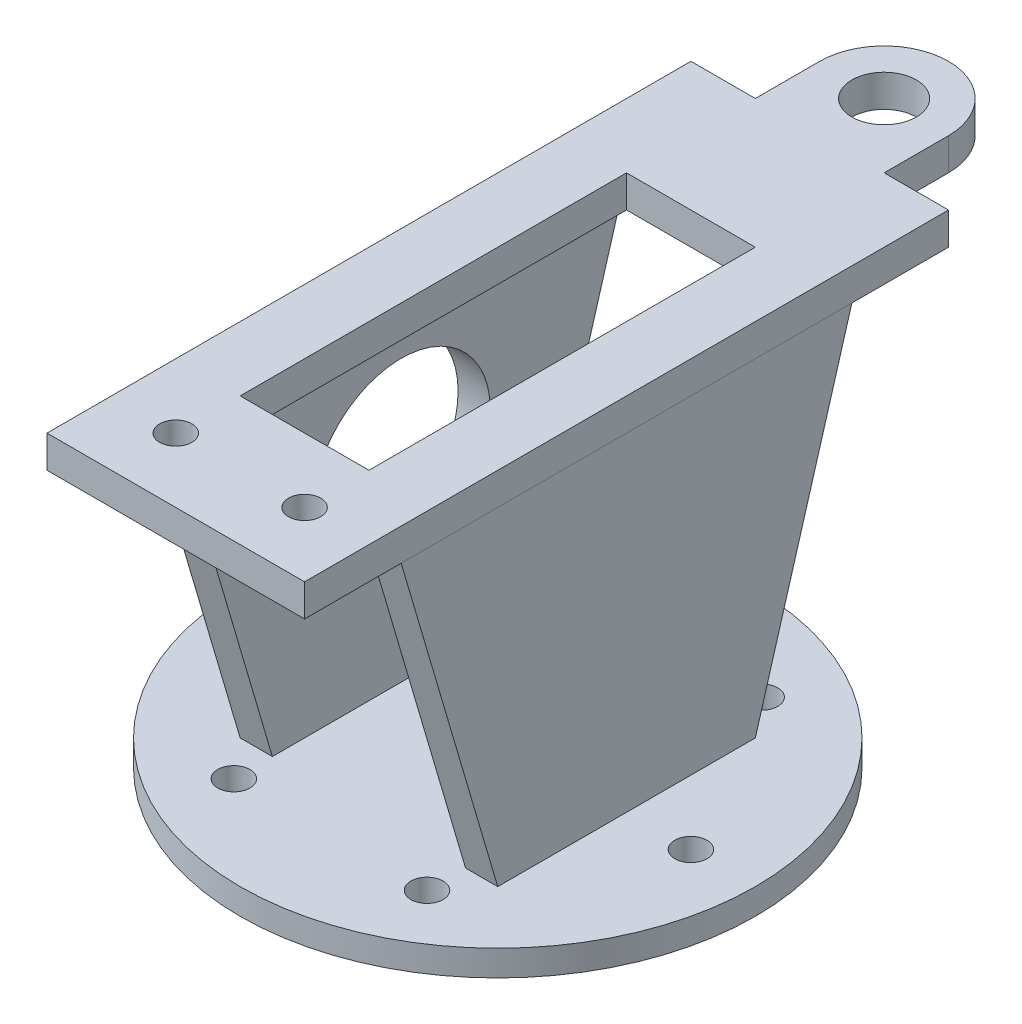
ISO-10303-21;
HEADER;
FILE_DESCRIPTION(('STEP AP214'),'2;1');
FILE_NAME('part.step','',(''),(''),'','','');
FILE_SCHEMA(('AUTOMOTIVE_DESIGN { 1 0 10303 214 1 1 1 1 }'));
ENDSEC;
DATA;
#1=APPLICATION_CONTEXT('core data for automotive mechanical design processes');
#2=APPLICATION_PROTOCOL_DEFINITION('international standard','automotive_design',2000,#1);
#3=PRODUCT_CONTEXT('',#1,'mechanical');
#4=PRODUCT('Part','Part','',(#3));
#5=PRODUCT_RELATED_PRODUCT_CATEGORY('part','',(#4));
#6=PRODUCT_DEFINITION_FORMATION('','',#4);
#7=PRODUCT_DEFINITION_CONTEXT('part definition',#1,'design');
#8=PRODUCT_DEFINITION('design','',#6,#7);
#9=PRODUCT_DEFINITION_SHAPE('','',#8);
#10=(LENGTH_UNIT() NAMED_UNIT(*) SI_UNIT(.MILLI.,.METRE.));
#11=(NAMED_UNIT(*) PLANE_ANGLE_UNIT() SI_UNIT($,.RADIAN.));
#12=(NAMED_UNIT(*) SI_UNIT($,.STERADIAN.) SOLID_ANGLE_UNIT());
#13=UNCERTAINTY_MEASURE_WITH_UNIT(LENGTH_MEASURE(1.E-05),#10,'distance_accuracy_value','');
#14=(GEOMETRIC_REPRESENTATION_CONTEXT(3) GLOBAL_UNCERTAINTY_ASSIGNED_CONTEXT((#13)) GLOBAL_UNIT_ASSIGNED_CONTEXT((#10,
#11,#12)) REPRESENTATION_CONTEXT('',''));
#15=CARTESIAN_POINT('',(0.,0.,0.));
#16=DIRECTION('',(0.,0.,1.));
#17=DIRECTION('',(1.,0.,0.));
#18=AXIS2_PLACEMENT_3D('',#15,#16,#17);
#19=CARTESIAN_POINT('',(19.05,69.85,-44.45));
#20=DIRECTION('',(0.,1.,0.));
#21=DIRECTION('',(0.,0.,1.));
#22=AXIS2_PLACEMENT_3D('',#19,#20,#21);
#23=PLANE('',#22);
#24=DIRECTION('',(0.,0.,1.));
#25=VECTOR('',#24,1.);
#26=CARTESIAN_POINT('',(25.4,69.85,-44.45));
#27=LINE('',#26,#25);
#28=CARTESIAN_POINT('',(25.4,69.85,-44.45));
#29=VERTEX_POINT('',#28);
#30=CARTESIAN_POINT('',(25.4,69.85,44.45));
#31=VERTEX_POINT('',#30);
#32=EDGE_CURVE('E114',#29,#31,#27,.T.);
#33=ORIENTED_EDGE('',*,*,#32,.F.);
#34=DIRECTION('',(1.,0.,0.));
#35=VECTOR('',#34,1.);
#36=CARTESIAN_POINT('',(19.05,69.85,-44.45));
#37=LINE('',#36,#35);
#38=CARTESIAN_POINT('',(19.05,69.85,-44.45));
#39=VERTEX_POINT('',#38);
#40=EDGE_CURVE('E12',#39,#29,#37,.T.);
#41=ORIENTED_EDGE('',*,*,#40,.F.);
#42=DIRECTION('',(0.,0.,1.));
#43=VECTOR('',#42,1.);
#44=CARTESIAN_POINT('',(19.05,69.85,-44.45));
#45=LINE('',#44,#43);
#46=CARTESIAN_POINT('',(19.05,69.85,44.45));
#47=VERTEX_POINT('',#46);
#48=EDGE_CURVE('E108',#39,#47,#45,.T.);
#49=ORIENTED_EDGE('',*,*,#48,.T.);
#50=DIRECTION('',(1.,0.,0.));
#51=VECTOR('',#50,1.);
#52=CARTESIAN_POINT('',(19.05,69.85,44.45));
#53=LINE('',#52,#51);
#54=EDGE_CURVE('E53',#47,#31,#53,.T.);
#55=ORIENTED_EDGE('',*,*,#54,.T.);
#56=EDGE_LOOP('',(#33,#41,#49,#55));
#57=FACE_BOUND('',#56,.T.);
#58=ADVANCED_FACE('F50',(#57),#23,.T.);
#59=CARTESIAN_POINT('',(19.05,5.08,-25.4));
#60=DIRECTION('',(0.,-0.28216632399155,-0.959365501571271));
#61=DIRECTION('',(0.,0.959365501571271,-0.28216632399155));
#62=AXIS2_PLACEMENT_3D('',#59,#60,#61);
#63=PLANE('',#62);
#64=DIRECTION('',(0.,0.959365501571271,-0.28216632399155));
#65=VECTOR('',#64,1.);
#66=CARTESIAN_POINT('',(25.4,5.08,-25.4));
#67=LINE('',#66,#65);
#68=CARTESIAN_POINT('',(25.4,5.08,-25.4));
#69=VERTEX_POINT('',#68);
#70=EDGE_CURVE('E110',#69,#29,#67,.T.);
#71=ORIENTED_EDGE('',*,*,#70,.F.);
#72=DIRECTION('',(1.,0.,0.));
#73=VECTOR('',#72,1.);
#74=CARTESIAN_POINT('',(19.05,5.08,-25.4));
#75=LINE('',#74,#73);
#76=CARTESIAN_POINT('',(19.05,5.08,-25.4));
#77=VERTEX_POINT('',#76);
#78=EDGE_CURVE('E59',#77,#69,#75,.T.);
#79=ORIENTED_EDGE('',*,*,#78,.F.);
#80=DIRECTION('',(0.,0.959365501571271,-0.28216632399155));
#81=VECTOR('',#80,1.);
#82=CARTESIAN_POINT('',(19.05,5.08,-25.4));
#83=LINE('',#82,#81);
#84=EDGE_CURVE('E105',#77,#39,#83,.T.);
#85=ORIENTED_EDGE('',*,*,#84,.T.);
#86=ORIENTED_EDGE('',*,*,#40,.T.);
#87=EDGE_LOOP('',(#71,#79,#85,#86));
#88=FACE_BOUND('',#87,.T.);
#89=ADVANCED_FACE('F124',(#88),#63,.T.);
#90=CARTESIAN_POINT('',(19.05,5.08,0.));
#91=DIRECTION('',(0.,-1.,0.));
#92=DIRECTION('',(0.,0.,-1.));
#93=AXIS2_PLACEMENT_3D('',#90,#91,#92);
#94=PLANE('',#93);
#95=DIRECTION('',(0.,0.,-1.));
#96=VECTOR('',#95,1.);
#97=CARTESIAN_POINT('',(25.4,5.08,0.));
#98=LINE('',#97,#96);
#99=CARTESIAN_POINT('',(25.4,5.08,25.4));
#100=VERTEX_POINT('',#99);
#101=EDGE_CURVE('E99',#100,#69,#98,.T.);
#102=ORIENTED_EDGE('',*,*,#101,.F.);
#103=DIRECTION('',(1.,0.,0.));
#104=VECTOR('',#103,1.);
#105=CARTESIAN_POINT('',(19.05,5.08,25.4));
#106=LINE('',#105,#104);
#107=CARTESIAN_POINT('',(19.05,5.08,25.4));
#108=VERTEX_POINT('',#107);
#109=EDGE_CURVE('E95',#108,#100,#106,.T.);
#110=ORIENTED_EDGE('',*,*,#109,.F.);
#111=DIRECTION('',(0.,0.,-1.));
#112=VECTOR('',#111,1.);
#113=CARTESIAN_POINT('',(19.05,5.08,25.4));
#114=LINE('',#113,#112);
#115=EDGE_CURVE('E98',#108,#77,#114,.T.);
#116=ORIENTED_EDGE('',*,*,#115,.T.);
#117=ORIENTED_EDGE('',*,*,#78,.T.);
#118=EDGE_LOOP('',(#102,#110,#116,#117));
#119=FACE_BOUND('',#118,.T.);
#120=ADVANCED_FACE('F97',(#119),#94,.T.);
#121=CARTESIAN_POINT('',(19.05,69.85,44.45));
#122=DIRECTION('',(0.,-0.28216632399155,0.959365501571271));
#123=DIRECTION('',(0.,-0.959365501571271,-0.28216632399155));
#124=AXIS2_PLACEMENT_3D('',#121,#122,#123);
#125=PLANE('',#124);
#126=DIRECTION('',(0.,-0.959365501571271,-0.28216632399155));
#127=VECTOR('',#126,1.);
#128=CARTESIAN_POINT('',(25.4,69.85,44.45));
#129=LINE('',#128,#127);
#130=EDGE_CURVE('E117',#31,#100,#129,.T.);
#131=ORIENTED_EDGE('',*,*,#130,.F.);
#132=ORIENTED_EDGE('',*,*,#54,.F.);
#133=DIRECTION('',(0.,-0.959365501571271,-0.28216632399155));
#134=VECTOR('',#133,1.);
#135=CARTESIAN_POINT('',(19.05,69.85,44.45));
#136=LINE('',#135,#134);
#137=EDGE_CURVE('E104',#47,#108,#136,.T.);
#138=ORIENTED_EDGE('',*,*,#137,.T.);
#139=ORIENTED_EDGE('',*,*,#109,.T.);
#140=EDGE_LOOP('',(#131,#132,#138,#139));
#141=FACE_BOUND('',#140,.T.);
#142=ADVANCED_FACE('F107',(#141),#125,.T.);
#143=CARTESIAN_POINT('',(19.05,0.,0.));
#144=DIRECTION('',(1.,0.,0.));
#145=DIRECTION('',(0.,0.,-1.));
#146=AXIS2_PLACEMENT_3D('',#143,#144,#145);
#147=PLANE('',#146);
#148=ORIENTED_EDGE('',*,*,#48,.F.);
#149=ORIENTED_EDGE('',*,*,#84,.F.);
#150=ORIENTED_EDGE('',*,*,#115,.F.);
#151=ORIENTED_EDGE('',*,*,#137,.F.);
#152=EDGE_LOOP('',(#148,#149,#150,#151));
#153=FACE_BOUND('',#152,.T.);
#154=ADVANCED_FACE('F103',(#153),#147,.F.);
#155=CARTESIAN_POINT('',(25.4,0.,0.));
#156=DIRECTION('',(1.,0.,0.));
#157=DIRECTION('',(0.,0.,-1.));
#158=AXIS2_PLACEMENT_3D('',#155,#156,#157);
#159=PLANE('',#158);
#160=ORIENTED_EDGE('',*,*,#32,.T.);
#161=ORIENTED_EDGE('',*,*,#130,.T.);
#162=ORIENTED_EDGE('',*,*,#101,.T.);
#163=ORIENTED_EDGE('',*,*,#70,.T.);
#164=EDGE_LOOP('',(#160,#161,#162,#163));
#165=FACE_BOUND('',#164,.T.);
#166=ADVANCED_FACE('F123',(#165),#159,.T.);
#167=CLOSED_SHELL('',(#58,#89,#120,#142,#154,#166));
#168=MANIFOLD_SOLID_BREP('B2',#167);
#169=CARTESIAN_POINT('',(-19.05,0.,0.));
#170=DIRECTION('',(1.,0.,0.));
#171=DIRECTION('',(0.,0.,-1.));
#172=AXIS2_PLACEMENT_3D('',#169,#170,#171);
#173=PLANE('',#172);
#174=DIRECTION('',(0.,0.,-1.));
#175=VECTOR('',#174,1.);
#176=CARTESIAN_POINT('',(-19.05,5.08,25.4));
#177=LINE('',#176,#175);
#178=CARTESIAN_POINT('',(-19.05,5.08,25.4));
#179=VERTEX_POINT('',#178);
#180=CARTESIAN_POINT('',(-19.05,5.08,-25.4));
#181=VERTEX_POINT('',#180);
#182=EDGE_CURVE('E233',#179,#181,#177,.T.);
#183=ORIENTED_EDGE('',*,*,#182,.T.);
#184=DIRECTION('',(0.,0.959365501571271,-0.28216632399155));
#185=VECTOR('',#184,1.);
#186=CARTESIAN_POINT('',(-19.05,5.08,-25.4));
#187=LINE('',#186,#185);
#188=CARTESIAN_POINT('',(-19.05,69.85,-44.45));
#189=VERTEX_POINT('',#188);
#190=EDGE_CURVE('E236',#181,#189,#187,.T.);
#191=ORIENTED_EDGE('',*,*,#190,.T.);
#192=DIRECTION('',(0.,0.,1.));
#193=VECTOR('',#192,1.);
#194=CARTESIAN_POINT('',(-19.05,69.85,-44.45));
#195=LINE('',#194,#193);
#196=CARTESIAN_POINT('',(-19.05,69.85,44.45));
#197=VERTEX_POINT('',#196);
#198=EDGE_CURVE('E240',#189,#197,#195,.T.);
#199=ORIENTED_EDGE('',*,*,#198,.T.);
#200=DIRECTION('',(0.,-0.959365501571271,-0.28216632399155));
#201=VECTOR('',#200,1.);
#202=CARTESIAN_POINT('',(-19.05,69.85,44.45));
#203=LINE('',#202,#201);
#204=EDGE_CURVE('E204',#197,#179,#203,.T.);
#205=ORIENTED_EDGE('',*,*,#204,.T.);
#206=EDGE_LOOP('',(#183,#191,#199,#205));
#207=FACE_BOUND('',#206,.T.);
#208=CARTESIAN_POINT('',(-19.05,42.8113563573053,0.));
#209=DIRECTION('',(1.,0.,0.));
#210=DIRECTION('',(0.,0.,-1.));
#211=AXIS2_PLACEMENT_3D('',#208,#209,#210);
#212=CIRCLE('',#211,17.5838015491556);
#213=CARTESIAN_POINT('',(-19.05,42.8113563573053,-17.5838015491556));
#214=VERTEX_POINT('',#213);
#215=EDGE_CURVE('E253',#214,#214,#212,.T.);
#216=ORIENTED_EDGE('',*,*,#215,.F.);
#217=EDGE_LOOP('',(#216));
#218=FACE_BOUND('',#217,.T.);
#219=ADVANCED_FACE('F187',(#207,#218),#173,.T.);
#220=CARTESIAN_POINT('',(-25.4,0.,0.));
#221=DIRECTION('',(1.,0.,0.));
#222=DIRECTION('',(0.,0.,-1.));
#223=AXIS2_PLACEMENT_3D('',#220,#221,#222);
#224=PLANE('',#223);
#225=DIRECTION('',(0.,0.,-1.));
#226=VECTOR('',#225,1.);
#227=CARTESIAN_POINT('',(-25.4,5.08,0.));
#228=LINE('',#227,#226);
#229=CARTESIAN_POINT('',(-25.4,5.08,25.4));
#230=VERTEX_POINT('',#229);
#231=CARTESIAN_POINT('',(-25.4,5.08,-25.4));
#232=VERTEX_POINT('',#231);
#233=EDGE_CURVE('E228',#230,#232,#228,.T.);
#234=ORIENTED_EDGE('',*,*,#233,.F.);
#235=DIRECTION('',(0.,-0.959365501571271,-0.28216632399155));
#236=VECTOR('',#235,1.);
#237=CARTESIAN_POINT('',(-25.4,69.85,44.45));
#238=LINE('',#237,#236);
#239=CARTESIAN_POINT('',(-25.4,69.85,44.45));
#240=VERTEX_POINT('',#239);
#241=EDGE_CURVE('E256',#240,#230,#238,.T.);
#242=ORIENTED_EDGE('',*,*,#241,.F.);
#243=DIRECTION('',(0.,0.,1.));
#244=VECTOR('',#243,1.);
#245=CARTESIAN_POINT('',(-25.4,69.85,-44.45));
#246=LINE('',#245,#244);
#247=CARTESIAN_POINT('',(-25.4,69.85,-44.45));
#248=VERTEX_POINT('',#247);
#249=EDGE_CURVE('E221',#248,#240,#246,.T.);
#250=ORIENTED_EDGE('',*,*,#249,.F.);
#251=DIRECTION('',(0.,0.959365501571271,-0.28216632399155));
#252=VECTOR('',#251,1.);
#253=CARTESIAN_POINT('',(-25.4,5.08,-25.4));
#254=LINE('',#253,#252);
#255=EDGE_CURVE('E244',#232,#248,#254,.T.);
#256=ORIENTED_EDGE('',*,*,#255,.F.);
#257=EDGE_LOOP('',(#234,#242,#250,#256));
#258=FACE_BOUND('',#257,.T.);
#259=CARTESIAN_POINT('',(-25.4,42.8113563573053,0.));
#260=DIRECTION('',(1.,0.,0.));
#261=DIRECTION('',(0.,0.,-1.));
#262=AXIS2_PLACEMENT_3D('',#259,#260,#261);
#263=CIRCLE('',#262,17.5838015491556);
#264=CARTESIAN_POINT('',(-25.4,42.8113563573053,-17.5838015491556));
#265=VERTEX_POINT('',#264);
#266=EDGE_CURVE('E268',#265,#265,#263,.T.);
#267=ORIENTED_EDGE('',*,*,#266,.T.);
#268=EDGE_LOOP('',(#267));
#269=FACE_BOUND('',#268,.T.);
#270=ADVANCED_FACE('F262',(#258,#269),#224,.F.);
#271=CARTESIAN_POINT('',(-19.05,5.08,0.));
#272=DIRECTION('',(0.,1.,0.));
#273=DIRECTION('',(0.,0.,1.));
#274=AXIS2_PLACEMENT_3D('',#271,#272,#273);
#275=PLANE('',#274);
#276=ORIENTED_EDGE('',*,*,#233,.T.);
#277=DIRECTION('',(-1.,0.,0.));
#278=VECTOR('',#277,1.);
#279=CARTESIAN_POINT('',(-19.05,5.08,-25.4));
#280=LINE('',#279,#278);
#281=EDGE_CURVE('E48',#181,#232,#280,.T.);
#282=ORIENTED_EDGE('',*,*,#281,.F.);
#283=ORIENTED_EDGE('',*,*,#182,.F.);
#284=DIRECTION('',(-1.,0.,0.));
#285=VECTOR('',#284,1.);
#286=CARTESIAN_POINT('',(-19.05,5.08,25.4));
#287=LINE('',#286,#285);
#288=EDGE_CURVE('E248',#179,#230,#287,.T.);
#289=ORIENTED_EDGE('',*,*,#288,.T.);
#290=EDGE_LOOP('',(#276,#282,#283,#289));
#291=FACE_BOUND('',#290,.T.);
#292=ADVANCED_FACE('F189',(#291),#275,.F.);
#293=CARTESIAN_POINT('',(-19.05,5.08,-25.4));
#294=DIRECTION('',(0.,0.28216632399155,0.959365501571271));
#295=DIRECTION('',(0.,-0.959365501571271,0.28216632399155));
#296=AXIS2_PLACEMENT_3D('',#293,#294,#295);
#297=PLANE('',#296);
#298=ORIENTED_EDGE('',*,*,#255,.T.);
#299=DIRECTION('',(-1.,0.,0.));
#300=VECTOR('',#299,1.);
#301=CARTESIAN_POINT('',(-19.05,69.85,-44.45));
#302=LINE('',#301,#300);
#303=EDGE_CURVE('E196',#189,#248,#302,.T.);
#304=ORIENTED_EDGE('',*,*,#303,.F.);
#305=ORIENTED_EDGE('',*,*,#190,.F.);
#306=ORIENTED_EDGE('',*,*,#281,.T.);
#307=EDGE_LOOP('',(#298,#304,#305,#306));
#308=FACE_BOUND('',#307,.T.);
#309=ADVANCED_FACE('F243',(#308),#297,.F.);
#310=CARTESIAN_POINT('',(-19.05,69.85,-44.45));
#311=DIRECTION('',(0.,-1.,0.));
#312=DIRECTION('',(0.,0.,-1.));
#313=AXIS2_PLACEMENT_3D('',#310,#311,#312);
#314=PLANE('',#313);
#315=ORIENTED_EDGE('',*,*,#249,.T.);
#316=DIRECTION('',(-1.,0.,0.));
#317=VECTOR('',#316,1.);
#318=CARTESIAN_POINT('',(-19.05,69.85,44.45));
#319=LINE('',#318,#317);
#320=EDGE_CURVE('E245',#197,#240,#319,.T.);
#321=ORIENTED_EDGE('',*,*,#320,.F.);
#322=ORIENTED_EDGE('',*,*,#198,.F.);
#323=ORIENTED_EDGE('',*,*,#303,.T.);
#324=EDGE_LOOP('',(#315,#321,#322,#323));
#325=FACE_BOUND('',#324,.T.);
#326=ADVANCED_FACE('F246',(#325),#314,.F.);
#327=CARTESIAN_POINT('',(-19.05,69.85,44.45));
#328=DIRECTION('',(0.,0.28216632399155,-0.959365501571271));
#329=DIRECTION('',(0.,0.959365501571271,0.28216632399155));
#330=AXIS2_PLACEMENT_3D('',#327,#328,#329);
#331=PLANE('',#330);
#332=ORIENTED_EDGE('',*,*,#241,.T.);
#333=ORIENTED_EDGE('',*,*,#288,.F.);
#334=ORIENTED_EDGE('',*,*,#204,.F.);
#335=ORIENTED_EDGE('',*,*,#320,.T.);
#336=EDGE_LOOP('',(#332,#333,#334,#335));
#337=FACE_BOUND('',#336,.T.);
#338=ADVANCED_FACE('F261',(#337),#331,.F.);
#339=CARTESIAN_POINT('',(-19.05,42.8113563573053,0.));
#340=DIRECTION('',(-1.,0.,0.));
#341=DIRECTION('',(0.,0.,1.));
#342=AXIS2_PLACEMENT_3D('',#339,#340,#341);
#343=CYLINDRICAL_SURFACE('',#342,17.5838015491556);
#344=ORIENTED_EDGE('',*,*,#215,.T.);
#345=EDGE_LOOP('',(#344));
#346=FACE_BOUND('',#345,.T.);
#347=ORIENTED_EDGE('',*,*,#266,.F.);
#348=EDGE_LOOP('',(#347));
#349=FACE_BOUND('',#348,.T.);
#350=ADVANCED_FACE('F275',(#346,#349),#343,.F.);
#351=CLOSED_SHELL('',(#219,#270,#292,#309,#326,#338,#350));
#352=MANIFOLD_SOLID_BREP('B6',#351);
#353=CARTESIAN_POINT('',(0.,76.2,-76.2));
#354=DIRECTION('',(0.,-1.,0.));
#355=DIRECTION('',(0.,0.,-1.));
#356=AXIS2_PLACEMENT_3D('',#353,#354,#355);
#357=PLANE('',#356);
#358=DIRECTION('',(0.,0.,1.));
#359=VECTOR('',#358,1.);
#360=CARTESIAN_POINT('',(-25.4,76.2,63.5));
#361=LINE('',#360,#359);
#362=CARTESIAN_POINT('',(-25.4,76.2,-63.5));
#363=VERTEX_POINT('',#362);
#364=CARTESIAN_POINT('',(-25.4,76.2,63.5));
#365=VERTEX_POINT('',#364);
#366=EDGE_CURVE('E469',#363,#365,#361,.T.);
#367=ORIENTED_EDGE('',*,*,#366,.T.);
#368=DIRECTION('',(1.,0.,0.));
#369=VECTOR('',#368,1.);
#370=CARTESIAN_POINT('',(25.4,76.2,63.5));
#371=LINE('',#370,#369);
#372=CARTESIAN_POINT('',(25.4,76.2,63.5));
#373=VERTEX_POINT('',#372);
#374=EDGE_CURVE('E472',#365,#373,#371,.T.);
#375=ORIENTED_EDGE('',*,*,#374,.T.);
#376=DIRECTION('',(0.,0.,-1.));
#377=VECTOR('',#376,1.);
#378=CARTESIAN_POINT('',(25.4,76.2,63.5));
#379=LINE('',#378,#377);
#380=CARTESIAN_POINT('',(25.4,76.2,-63.5));
#381=VERTEX_POINT('',#380);
#382=EDGE_CURVE('E475',#373,#381,#379,.T.);
#383=ORIENTED_EDGE('',*,*,#382,.T.);
#384=DIRECTION('',(-1.,0.,0.));
#385=VECTOR('',#384,1.);
#386=CARTESIAN_POINT('',(25.4,76.2,-63.5));
#387=LINE('',#386,#385);
#388=CARTESIAN_POINT('',(12.7,76.2,-63.5));
#389=VERTEX_POINT('',#388);
#390=EDGE_CURVE('E477',#381,#389,#387,.T.);
#391=ORIENTED_EDGE('',*,*,#390,.T.);
#392=DIRECTION('',(0.,0.,-1.));
#393=VECTOR('',#392,1.);
#394=CARTESIAN_POINT('',(12.7,76.2,-63.5));
#395=LINE('',#394,#393);
#396=CARTESIAN_POINT('',(12.7,76.2,-76.2));
#397=VERTEX_POINT('',#396);
#398=EDGE_CURVE('E479',#389,#397,#395,.T.);
#399=ORIENTED_EDGE('',*,*,#398,.T.);
#400=CARTESIAN_POINT('',(0.,76.2,-76.2));
#401=DIRECTION('',(0.,1.,0.));
#402=DIRECTION('',(0.,0.,-1.));
#403=AXIS2_PLACEMENT_3D('',#400,#401,#402);
#404=CIRCLE('',#403,12.7);
#405=CARTESIAN_POINT('',(-12.7,76.2,-76.2));
#406=VERTEX_POINT('',#405);
#407=EDGE_CURVE('E481',#397,#406,#404,.T.);
#408=ORIENTED_EDGE('',*,*,#407,.T.);
#409=DIRECTION('',(0.,0.,1.));
#410=VECTOR('',#409,1.);
#411=CARTESIAN_POINT('',(-12.7,76.2,-63.5));
#412=LINE('',#411,#410);
#413=CARTESIAN_POINT('',(-12.7,76.2,-63.5));
#414=VERTEX_POINT('',#413);
#415=EDGE_CURVE('E483',#406,#414,#412,.T.);
#416=ORIENTED_EDGE('',*,*,#415,.T.);
#417=DIRECTION('',(-1.,0.,0.));
#418=VECTOR('',#417,1.);
#419=CARTESIAN_POINT('',(-12.7,76.2,-63.5));
#420=LINE('',#419,#418);
#421=EDGE_CURVE('E485',#414,#363,#420,.T.);
#422=ORIENTED_EDGE('',*,*,#421,.T.);
#423=EDGE_LOOP('',(#367,#375,#383,#391,#399,#408,#416,#422));
#424=FACE_BOUND('',#423,.T.);
#425=DIRECTION('',(0.,0.,1.));
#426=VECTOR('',#425,1.);
#427=CARTESIAN_POINT('',(-12.7,76.2,38.1));
#428=LINE('',#427,#426);
#429=CARTESIAN_POINT('',(-12.7,76.2,-38.1));
#430=VERTEX_POINT('',#429);
#431=CARTESIAN_POINT('',(-12.7,76.2,38.1));
#432=VERTEX_POINT('',#431);
#433=EDGE_CURVE('E430',#430,#432,#428,.T.);
#434=ORIENTED_EDGE('',*,*,#433,.F.);
#435=DIRECTION('',(-1.,0.,0.));
#436=VECTOR('',#435,1.);
#437=CARTESIAN_POINT('',(12.7,76.2,-38.1));
#438=LINE('',#437,#436);
#439=CARTESIAN_POINT('',(12.7,76.2,-38.1));
#440=VERTEX_POINT('',#439);
#441=EDGE_CURVE('E453',#440,#430,#438,.T.);
#442=ORIENTED_EDGE('',*,*,#441,.F.);
#443=DIRECTION('',(0.,0.,-1.));
#444=VECTOR('',#443,1.);
#445=CARTESIAN_POINT('',(12.7,76.2,38.1));
#446=LINE('',#445,#444);
#447=CARTESIAN_POINT('',(12.7,76.2,38.1));
#448=VERTEX_POINT('',#447);
#449=EDGE_CURVE('E451',#448,#440,#446,.T.);
#450=ORIENTED_EDGE('',*,*,#449,.F.);
#451=DIRECTION('',(1.,0.,0.));
#452=VECTOR('',#451,1.);
#453=CARTESIAN_POINT('',(12.7,76.2,38.1));
#454=LINE('',#453,#452);
#455=EDGE_CURVE('E438',#432,#448,#454,.T.);
#456=ORIENTED_EDGE('',*,*,#455,.F.);
#457=EDGE_LOOP('',(#434,#442,#450,#456));
#458=FACE_BOUND('',#457,.T.);
#459=CARTESIAN_POINT('',(0.,76.2,-76.2));
#460=DIRECTION('',(0.,1.,0.));
#461=DIRECTION('',(0.,0.,1.));
#462=AXIS2_PLACEMENT_3D('',#459,#460,#461);
#463=CIRCLE('',#462,6.35);
#464=CARTESIAN_POINT('',(0.,76.2,-69.85));
#465=VERTEX_POINT('',#464);
#466=EDGE_CURVE('E459',#465,#465,#463,.T.);
#467=ORIENTED_EDGE('',*,*,#466,.F.);
#468=EDGE_LOOP('',(#467));
#469=FACE_BOUND('',#468,.T.);
#470=CARTESIAN_POINT('',(12.7,76.2,50.8));
#471=DIRECTION('',(0.,1.,0.));
#472=DIRECTION('',(0.,0.,1.));
#473=AXIS2_PLACEMENT_3D('',#470,#471,#472);
#474=CIRCLE('',#473,3.175);
#475=CARTESIAN_POINT('',(12.7,76.2,53.975));
#476=VERTEX_POINT('',#475);
#477=EDGE_CURVE('E621',#476,#476,#474,.T.);
#478=ORIENTED_EDGE('',*,*,#477,.F.);
#479=EDGE_LOOP('',(#478));
#480=FACE_BOUND('',#479,.T.);
#481=CARTESIAN_POINT('',(-12.7,76.2,50.8));
#482=DIRECTION('',(0.,1.,0.));
#483=DIRECTION('',(0.,0.,1.));
#484=AXIS2_PLACEMENT_3D('',#481,#482,#483);
#485=CIRCLE('',#484,3.175);
#486=CARTESIAN_POINT('',(-12.7,76.2,53.975));
#487=VERTEX_POINT('',#486);
#488=EDGE_CURVE('E612',#487,#487,#485,.T.);
#489=ORIENTED_EDGE('',*,*,#488,.F.);
#490=EDGE_LOOP('',(#489));
#491=FACE_BOUND('',#490,.T.);
#492=ADVANCED_FACE('F341',(#424,#458,#469,#480,#491),#357,.F.);
#493=CARTESIAN_POINT('',(0.,69.85,-76.2));
#494=DIRECTION('',(0.,-1.,0.));
#495=DIRECTION('',(0.,0.,-1.));
#496=AXIS2_PLACEMENT_3D('',#493,#494,#495);
#497=PLANE('',#496);
#498=CARTESIAN_POINT('',(12.7,69.85,50.8));
#499=DIRECTION('',(0.,1.,0.));
#500=DIRECTION('',(0.,0.,1.));
#501=AXIS2_PLACEMENT_3D('',#498,#499,#500);
#502=CIRCLE('',#501,3.175);
#503=CARTESIAN_POINT('',(12.7,69.85,53.975));
#504=VERTEX_POINT('',#503);
#505=EDGE_CURVE('E618',#504,#504,#502,.T.);
#506=ORIENTED_EDGE('',*,*,#505,.T.);
#507=EDGE_LOOP('',(#506));
#508=FACE_BOUND('',#507,.T.);
#509=DIRECTION('',(-1.,0.,0.));
#510=VECTOR('',#509,1.);
#511=CARTESIAN_POINT('',(12.7,69.85,-38.1));
#512=LINE('',#511,#510);
#513=CARTESIAN_POINT('',(12.7,69.85,-38.1));
#514=VERTEX_POINT('',#513);
#515=CARTESIAN_POINT('',(-12.7,69.85,-38.1));
#516=VERTEX_POINT('',#515);
#517=EDGE_CURVE('E439',#514,#516,#512,.T.);
#518=ORIENTED_EDGE('',*,*,#517,.T.);
#519=DIRECTION('',(0.,0.,1.));
#520=VECTOR('',#519,1.);
#521=CARTESIAN_POINT('',(-12.7,69.85,38.1));
#522=LINE('',#521,#520);
#523=CARTESIAN_POINT('',(-12.7,69.85,38.1));
#524=VERTEX_POINT('',#523);
#525=EDGE_CURVE('E364',#516,#524,#522,.T.);
#526=ORIENTED_EDGE('',*,*,#525,.T.);
#527=DIRECTION('',(1.,0.,0.));
#528=VECTOR('',#527,1.);
#529=CARTESIAN_POINT('',(12.7,69.85,38.1));
#530=LINE('',#529,#528);
#531=CARTESIAN_POINT('',(12.7,69.85,38.1));
#532=VERTEX_POINT('',#531);
#533=EDGE_CURVE('E445',#524,#532,#530,.T.);
#534=ORIENTED_EDGE('',*,*,#533,.T.);
#535=DIRECTION('',(0.,0.,-1.));
#536=VECTOR('',#535,1.);
#537=CARTESIAN_POINT('',(12.7,69.85,38.1));
#538=LINE('',#537,#536);
#539=EDGE_CURVE('E461',#532,#514,#538,.T.);
#540=ORIENTED_EDGE('',*,*,#539,.T.);
#541=EDGE_LOOP('',(#518,#526,#534,#540));
#542=FACE_BOUND('',#541,.T.);
#543=DIRECTION('',(0.,0.,1.));
#544=VECTOR('',#543,1.);
#545=CARTESIAN_POINT('',(-25.4,69.85,63.5));
#546=LINE('',#545,#544);
#547=CARTESIAN_POINT('',(-25.4,69.85,-63.5));
#548=VERTEX_POINT('',#547);
#549=CARTESIAN_POINT('',(-25.4,69.85,63.5));
#550=VERTEX_POINT('',#549);
#551=EDGE_CURVE('E446',#548,#550,#546,.T.);
#552=ORIENTED_EDGE('',*,*,#551,.F.);
#553=DIRECTION('',(-1.,0.,0.));
#554=VECTOR('',#553,1.);
#555=CARTESIAN_POINT('',(-12.7,69.85,-63.5));
#556=LINE('',#555,#554);
#557=CARTESIAN_POINT('',(-12.7,69.85,-63.5));
#558=VERTEX_POINT('',#557);
#559=EDGE_CURVE('E473',#558,#548,#556,.T.);
#560=ORIENTED_EDGE('',*,*,#559,.F.);
#561=DIRECTION('',(0.,0.,1.));
#562=VECTOR('',#561,1.);
#563=CARTESIAN_POINT('',(-12.7,69.85,-63.5));
#564=LINE('',#563,#562);
#565=CARTESIAN_POINT('',(-12.7,69.85,-76.2));
#566=VERTEX_POINT('',#565);
#567=EDGE_CURVE('E500',#566,#558,#564,.T.);
#568=ORIENTED_EDGE('',*,*,#567,.F.);
#569=CARTESIAN_POINT('',(0.,69.85,-76.2));
#570=DIRECTION('',(0.,1.,0.));
#571=DIRECTION('',(0.,0.,-1.));
#572=AXIS2_PLACEMENT_3D('',#569,#570,#571);
#573=CIRCLE('',#572,12.7);
#574=CARTESIAN_POINT('',(12.7,69.85,-76.2));
#575=VERTEX_POINT('',#574);
#576=EDGE_CURVE('E498',#575,#566,#573,.T.);
#577=ORIENTED_EDGE('',*,*,#576,.F.);
#578=DIRECTION('',(0.,0.,-1.));
#579=VECTOR('',#578,1.);
#580=CARTESIAN_POINT('',(12.7,69.85,-63.5));
#581=LINE('',#580,#579);
#582=CARTESIAN_POINT('',(12.7,69.85,-63.5));
#583=VERTEX_POINT('',#582);
#584=EDGE_CURVE('E496',#583,#575,#581,.T.);
#585=ORIENTED_EDGE('',*,*,#584,.F.);
#586=DIRECTION('',(-1.,0.,0.));
#587=VECTOR('',#586,1.);
#588=CARTESIAN_POINT('',(25.4,69.85,-63.5));
#589=LINE('',#588,#587);
#590=CARTESIAN_POINT('',(25.4,69.85,-63.5));
#591=VERTEX_POINT('',#590);
#592=EDGE_CURVE('E494',#591,#583,#589,.T.);
#593=ORIENTED_EDGE('',*,*,#592,.F.);
#594=DIRECTION('',(0.,0.,-1.));
#595=VECTOR('',#594,1.);
#596=CARTESIAN_POINT('',(25.4,69.85,63.5));
#597=LINE('',#596,#595);
#598=CARTESIAN_POINT('',(25.4,69.85,63.5));
#599=VERTEX_POINT('',#598);
#600=EDGE_CURVE('E492',#599,#591,#597,.T.);
#601=ORIENTED_EDGE('',*,*,#600,.F.);
#602=DIRECTION('',(1.,0.,0.));
#603=VECTOR('',#602,1.);
#604=CARTESIAN_POINT('',(25.4,69.85,63.5));
#605=LINE('',#604,#603);
#606=EDGE_CURVE('E490',#550,#599,#605,.T.);
#607=ORIENTED_EDGE('',*,*,#606,.F.);
#608=EDGE_LOOP('',(#552,#560,#568,#577,#585,#593,#601,#607));
#609=FACE_BOUND('',#608,.T.);
#610=CARTESIAN_POINT('',(0.,69.85,-76.2));
#611=DIRECTION('',(0.,1.,0.));
#612=DIRECTION('',(0.,0.,1.));
#613=AXIS2_PLACEMENT_3D('',#610,#611,#612);
#614=CIRCLE('',#613,6.35);
#615=CARTESIAN_POINT('',(0.,69.85,-69.85));
#616=VERTEX_POINT('',#615);
#617=EDGE_CURVE('E624',#616,#616,#614,.T.);
#618=ORIENTED_EDGE('',*,*,#617,.T.);
#619=EDGE_LOOP('',(#618));
#620=FACE_BOUND('',#619,.T.);
#621=CARTESIAN_POINT('',(-12.7,69.85,50.8));
#622=DIRECTION('',(0.,1.,0.));
#623=DIRECTION('',(0.,0.,1.));
#624=AXIS2_PLACEMENT_3D('',#621,#622,#623);
#625=CIRCLE('',#624,3.175);
#626=CARTESIAN_POINT('',(-12.7,69.85,53.975));
#627=VERTEX_POINT('',#626);
#628=EDGE_CURVE('E615',#627,#627,#625,.T.);
#629=ORIENTED_EDGE('',*,*,#628,.T.);
#630=EDGE_LOOP('',(#629));
#631=FACE_BOUND('',#630,.T.);
#632=ADVANCED_FACE('F530',(#508,#542,#609,#620,#631),#497,.T.);
#633=CARTESIAN_POINT('',(-25.4,76.2,63.5));
#634=DIRECTION('',(1.,0.,0.));
#635=DIRECTION('',(0.,0.,-1.));
#636=AXIS2_PLACEMENT_3D('',#633,#634,#635);
#637=PLANE('',#636);
#638=ORIENTED_EDGE('',*,*,#551,.T.);
#639=DIRECTION('',(0.,-1.,0.));
#640=VECTOR('',#639,1.);
#641=CARTESIAN_POINT('',(-25.4,76.2,63.5));
#642=LINE('',#641,#640);
#643=EDGE_CURVE('E185',#365,#550,#642,.T.);
#644=ORIENTED_EDGE('',*,*,#643,.F.);
#645=ORIENTED_EDGE('',*,*,#366,.F.);
#646=DIRECTION('',(0.,-1.,0.));
#647=VECTOR('',#646,1.);
#648=CARTESIAN_POINT('',(-25.4,76.2,-63.5));
#649=LINE('',#648,#647);
#650=EDGE_CURVE('E487',#363,#548,#649,.T.);
#651=ORIENTED_EDGE('',*,*,#650,.T.);
#652=EDGE_LOOP('',(#638,#644,#645,#651));
#653=FACE_BOUND('',#652,.T.);
#654=ADVANCED_FACE('F343',(#653),#637,.F.);
#655=CARTESIAN_POINT('',(25.4,76.2,63.5));
#656=DIRECTION('',(0.,0.,-1.));
#657=DIRECTION('',(-1.,0.,0.));
#658=AXIS2_PLACEMENT_3D('',#655,#656,#657);
#659=PLANE('',#658);
#660=ORIENTED_EDGE('',*,*,#606,.T.);
#661=DIRECTION('',(0.,-1.,0.));
#662=VECTOR('',#661,1.);
#663=CARTESIAN_POINT('',(25.4,76.2,63.5));
#664=LINE('',#663,#662);
#665=EDGE_CURVE('E349',#373,#599,#664,.T.);
#666=ORIENTED_EDGE('',*,*,#665,.F.);
#667=ORIENTED_EDGE('',*,*,#374,.F.);
#668=ORIENTED_EDGE('',*,*,#643,.T.);
#669=EDGE_LOOP('',(#660,#666,#667,#668));
#670=FACE_BOUND('',#669,.T.);
#671=ADVANCED_FACE('F547',(#670),#659,.F.);
#672=CARTESIAN_POINT('',(25.4,76.2,63.5));
#673=DIRECTION('',(-1.,0.,0.));
#674=DIRECTION('',(0.,0.,1.));
#675=AXIS2_PLACEMENT_3D('',#672,#673,#674);
#676=PLANE('',#675);
#677=ORIENTED_EDGE('',*,*,#600,.T.);
#678=DIRECTION('',(0.,-1.,0.));
#679=VECTOR('',#678,1.);
#680=CARTESIAN_POINT('',(25.4,76.2,-63.5));
#681=LINE('',#680,#679);
#682=EDGE_CURVE('E517',#381,#591,#681,.T.);
#683=ORIENTED_EDGE('',*,*,#682,.F.);
#684=ORIENTED_EDGE('',*,*,#382,.F.);
#685=ORIENTED_EDGE('',*,*,#665,.T.);
#686=EDGE_LOOP('',(#677,#683,#684,#685));
#687=FACE_BOUND('',#686,.T.);
#688=ADVANCED_FACE('F524',(#687),#676,.F.);
#689=CARTESIAN_POINT('',(25.4,76.2,-63.5));
#690=DIRECTION('',(0.,0.,1.));
#691=DIRECTION('',(1.,0.,0.));
#692=AXIS2_PLACEMENT_3D('',#689,#690,#691);
#693=PLANE('',#692);
#694=ORIENTED_EDGE('',*,*,#592,.T.);
#695=DIRECTION('',(0.,-1.,0.));
#696=VECTOR('',#695,1.);
#697=CARTESIAN_POINT('',(12.7,76.2,-63.5));
#698=LINE('',#697,#696);
#699=EDGE_CURVE('E514',#389,#583,#698,.T.);
#700=ORIENTED_EDGE('',*,*,#699,.F.);
#701=ORIENTED_EDGE('',*,*,#390,.F.);
#702=ORIENTED_EDGE('',*,*,#682,.T.);
#703=EDGE_LOOP('',(#694,#700,#701,#702));
#704=FACE_BOUND('',#703,.T.);
#705=ADVANCED_FACE('F536',(#704),#693,.F.);
#706=CARTESIAN_POINT('',(12.7,76.2,-63.5));
#707=DIRECTION('',(-1.,0.,0.));
#708=DIRECTION('',(0.,0.,1.));
#709=AXIS2_PLACEMENT_3D('',#706,#707,#708);
#710=PLANE('',#709);
#711=ORIENTED_EDGE('',*,*,#584,.T.);
#712=DIRECTION('',(0.,-1.,0.));
#713=VECTOR('',#712,1.);
#714=CARTESIAN_POINT('',(12.7,76.2,-76.2));
#715=LINE('',#714,#713);
#716=EDGE_CURVE('E511',#397,#575,#715,.T.);
#717=ORIENTED_EDGE('',*,*,#716,.F.);
#718=ORIENTED_EDGE('',*,*,#398,.F.);
#719=ORIENTED_EDGE('',*,*,#699,.T.);
#720=EDGE_LOOP('',(#711,#717,#718,#719));
#721=FACE_BOUND('',#720,.T.);
#722=ADVANCED_FACE('F540',(#721),#710,.F.);
#723=CARTESIAN_POINT('',(0.,76.2,-76.2));
#724=DIRECTION('',(0.,-1.,0.));
#725=DIRECTION('',(0.,0.,-1.));
#726=AXIS2_PLACEMENT_3D('',#723,#724,#725);
#727=CYLINDRICAL_SURFACE('',#726,12.7);
#728=ORIENTED_EDGE('',*,*,#576,.T.);
#729=DIRECTION('',(0.,-1.,0.));
#730=VECTOR('',#729,1.);
#731=CARTESIAN_POINT('',(-12.7,76.2,-76.2));
#732=LINE('',#731,#730);
#733=EDGE_CURVE('E508',#406,#566,#732,.T.);
#734=ORIENTED_EDGE('',*,*,#733,.F.);
#735=ORIENTED_EDGE('',*,*,#407,.F.);
#736=ORIENTED_EDGE('',*,*,#716,.T.);
#737=EDGE_LOOP('',(#728,#734,#735,#736));
#738=FACE_BOUND('',#737,.T.);
#739=ADVANCED_FACE('F560',(#738),#727,.T.);
#740=CARTESIAN_POINT('',(-12.7,76.2,-63.5));
#741=DIRECTION('',(1.,0.,0.));
#742=DIRECTION('',(0.,0.,-1.));
#743=AXIS2_PLACEMENT_3D('',#740,#741,#742);
#744=PLANE('',#743);
#745=ORIENTED_EDGE('',*,*,#567,.T.);
#746=DIRECTION('',(0.,-1.,0.));
#747=VECTOR('',#746,1.);
#748=CARTESIAN_POINT('',(-12.7,76.2,-63.5));
#749=LINE('',#748,#747);
#750=EDGE_CURVE('E505',#414,#558,#749,.T.);
#751=ORIENTED_EDGE('',*,*,#750,.F.);
#752=ORIENTED_EDGE('',*,*,#415,.F.);
#753=ORIENTED_EDGE('',*,*,#733,.T.);
#754=EDGE_LOOP('',(#745,#751,#752,#753));
#755=FACE_BOUND('',#754,.T.);
#756=ADVANCED_FACE('F558',(#755),#744,.F.);
#757=CARTESIAN_POINT('',(-12.7,76.2,-63.5));
#758=DIRECTION('',(0.,0.,1.));
#759=DIRECTION('',(1.,0.,0.));
#760=AXIS2_PLACEMENT_3D('',#757,#758,#759);
#761=PLANE('',#760);
#762=ORIENTED_EDGE('',*,*,#559,.T.);
#763=ORIENTED_EDGE('',*,*,#650,.F.);
#764=ORIENTED_EDGE('',*,*,#421,.F.);
#765=ORIENTED_EDGE('',*,*,#750,.T.);
#766=EDGE_LOOP('',(#762,#763,#764,#765));
#767=FACE_BOUND('',#766,.T.);
#768=ADVANCED_FACE('F553',(#767),#761,.F.);
#769=CARTESIAN_POINT('',(-12.7,76.2,38.1));
#770=DIRECTION('',(1.,0.,0.));
#771=DIRECTION('',(0.,0.,-1.));
#772=AXIS2_PLACEMENT_3D('',#769,#770,#771);
#773=PLANE('',#772);
#774=ORIENTED_EDGE('',*,*,#525,.F.);
#775=DIRECTION('',(0.,-1.,0.));
#776=VECTOR('',#775,1.);
#777=CARTESIAN_POINT('',(-12.7,76.2,-38.1));
#778=LINE('',#777,#776);
#779=EDGE_CURVE('E434',#430,#516,#778,.T.);
#780=ORIENTED_EDGE('',*,*,#779,.F.);
#781=ORIENTED_EDGE('',*,*,#433,.T.);
#782=DIRECTION('',(0.,-1.,0.));
#783=VECTOR('',#782,1.);
#784=CARTESIAN_POINT('',(-12.7,76.2,38.1));
#785=LINE('',#784,#783);
#786=EDGE_CURVE('E433',#432,#524,#785,.T.);
#787=ORIENTED_EDGE('',*,*,#786,.T.);
#788=EDGE_LOOP('',(#774,#780,#781,#787));
#789=FACE_BOUND('',#788,.T.);
#790=ADVANCED_FACE('F432',(#789),#773,.T.);
#791=CARTESIAN_POINT('',(12.7,76.2,38.1));
#792=DIRECTION('',(0.,0.,-1.));
#793=DIRECTION('',(-1.,0.,0.));
#794=AXIS2_PLACEMENT_3D('',#791,#792,#793);
#795=PLANE('',#794);
#796=ORIENTED_EDGE('',*,*,#533,.F.);
#797=ORIENTED_EDGE('',*,*,#786,.F.);
#798=ORIENTED_EDGE('',*,*,#455,.T.);
#799=DIRECTION('',(0.,-1.,0.));
#800=VECTOR('',#799,1.);
#801=CARTESIAN_POINT('',(12.7,76.2,38.1));
#802=LINE('',#801,#800);
#803=EDGE_CURVE('E447',#448,#532,#802,.T.);
#804=ORIENTED_EDGE('',*,*,#803,.T.);
#805=EDGE_LOOP('',(#796,#797,#798,#804));
#806=FACE_BOUND('',#805,.T.);
#807=ADVANCED_FACE('F442',(#806),#795,.T.);
#808=CARTESIAN_POINT('',(12.7,76.2,38.1));
#809=DIRECTION('',(-1.,0.,0.));
#810=DIRECTION('',(0.,0.,1.));
#811=AXIS2_PLACEMENT_3D('',#808,#809,#810);
#812=PLANE('',#811);
#813=ORIENTED_EDGE('',*,*,#539,.F.);
#814=ORIENTED_EDGE('',*,*,#803,.F.);
#815=ORIENTED_EDGE('',*,*,#449,.T.);
#816=DIRECTION('',(0.,-1.,0.));
#817=VECTOR('',#816,1.);
#818=CARTESIAN_POINT('',(12.7,76.2,-38.1));
#819=LINE('',#818,#817);
#820=EDGE_CURVE('E356',#440,#514,#819,.T.);
#821=ORIENTED_EDGE('',*,*,#820,.T.);
#822=EDGE_LOOP('',(#813,#814,#815,#821));
#823=FACE_BOUND('',#822,.T.);
#824=ADVANCED_FACE('F586',(#823),#812,.T.);
#825=CARTESIAN_POINT('',(12.7,76.2,-38.1));
#826=DIRECTION('',(0.,0.,1.));
#827=DIRECTION('',(1.,0.,0.));
#828=AXIS2_PLACEMENT_3D('',#825,#826,#827);
#829=PLANE('',#828);
#830=ORIENTED_EDGE('',*,*,#517,.F.);
#831=ORIENTED_EDGE('',*,*,#820,.F.);
#832=ORIENTED_EDGE('',*,*,#441,.T.);
#833=ORIENTED_EDGE('',*,*,#779,.T.);
#834=EDGE_LOOP('',(#830,#831,#832,#833));
#835=FACE_BOUND('',#834,.T.);
#836=ADVANCED_FACE('F590',(#835),#829,.T.);
#837=CARTESIAN_POINT('',(0.,76.2,-76.2));
#838=DIRECTION('',(0.,-1.,0.));
#839=DIRECTION('',(0.,0.,-1.));
#840=AXIS2_PLACEMENT_3D('',#837,#838,#839);
#841=CYLINDRICAL_SURFACE('',#840,6.35);
#842=ORIENTED_EDGE('',*,*,#466,.T.);
#843=EDGE_LOOP('',(#842));
#844=FACE_BOUND('',#843,.T.);
#845=ORIENTED_EDGE('',*,*,#617,.F.);
#846=EDGE_LOOP('',(#845));
#847=FACE_BOUND('',#846,.T.);
#848=ADVANCED_FACE('F596',(#844,#847),#841,.F.);
#849=CARTESIAN_POINT('',(12.7,76.2,50.8));
#850=DIRECTION('',(0.,-1.,0.));
#851=DIRECTION('',(0.,0.,-1.));
#852=AXIS2_PLACEMENT_3D('',#849,#850,#851);
#853=CYLINDRICAL_SURFACE('',#852,3.175);
#854=ORIENTED_EDGE('',*,*,#477,.T.);
#855=EDGE_LOOP('',(#854));
#856=FACE_BOUND('',#855,.T.);
#857=ORIENTED_EDGE('',*,*,#505,.F.);
#858=EDGE_LOOP('',(#857));
#859=FACE_BOUND('',#858,.T.);
#860=ADVANCED_FACE('F599',(#856,#859),#853,.F.);
#861=CARTESIAN_POINT('',(-12.7,76.2,50.8));
#862=DIRECTION('',(0.,-1.,0.));
#863=DIRECTION('',(0.,0.,-1.));
#864=AXIS2_PLACEMENT_3D('',#861,#862,#863);
#865=CYLINDRICAL_SURFACE('',#864,3.175);
#866=ORIENTED_EDGE('',*,*,#488,.T.);
#867=EDGE_LOOP('',(#866));
#868=FACE_BOUND('',#867,.T.);
#869=ORIENTED_EDGE('',*,*,#628,.F.);
#870=EDGE_LOOP('',(#869));
#871=FACE_BOUND('',#870,.T.);
#872=ADVANCED_FACE('F603',(#868,#871),#865,.F.);
#873=CLOSED_SHELL('',(#492,#632,#654,#671,#688,#705,#722,#739,#756,#768,#790,#807,#824,#836,
#848,#860,#872));
#874=MANIFOLD_SOLID_BREP('B42',#873);
#875=CARTESIAN_POINT('',(0.,5.08,0.));
#876=DIRECTION('',(0.,1.,0.));
#877=DIRECTION('',(0.,0.,1.));
#878=AXIS2_PLACEMENT_3D('',#875,#876,#877);
#879=PLANE('',#878);
#880=CARTESIAN_POINT('',(-19.05,5.08,-32.9955678841871));
#881=DIRECTION('',(0.,1.,0.));
#882=DIRECTION('',(0.,0.,1.));
#883=AXIS2_PLACEMENT_3D('',#880,#881,#882);
#884=CIRCLE('',#883,3.17500000000006);
#885=CARTESIAN_POINT('',(-19.05,5.08,-29.820567884187));
#886=VERTEX_POINT('',#885);
#887=EDGE_CURVE('E772',#886,#886,#884,.T.);
#888=ORIENTED_EDGE('',*,*,#887,.F.);
#889=EDGE_LOOP('',(#888));
#890=FACE_BOUND('',#889,.T.);
#891=CARTESIAN_POINT('',(-19.05,5.08,32.9955678841871));
#892=DIRECTION('',(0.,1.,0.));
#893=DIRECTION('',(0.,0.,1.));
#894=AXIS2_PLACEMENT_3D('',#891,#892,#893);
#895=CIRCLE('',#894,3.17500000000001);
#896=CARTESIAN_POINT('',(-19.05,5.08,36.1705678841871));
#897=VERTEX_POINT('',#896);
#898=EDGE_CURVE('E760',#897,#897,#895,.T.);
#899=ORIENTED_EDGE('',*,*,#898,.F.);
#900=EDGE_LOOP('',(#899));
#901=FACE_BOUND('',#900,.T.);
#902=CARTESIAN_POINT('',(38.1,5.08,0.));
#903=DIRECTION('',(0.,1.,0.));
#904=DIRECTION('',(0.,0.,1.));
#905=AXIS2_PLACEMENT_3D('',#902,#903,#904);
#906=CIRCLE('',#905,3.17500000000006);
#907=CARTESIAN_POINT('',(38.1,5.08,3.17500000000006));
#908=VERTEX_POINT('',#907);
#909=EDGE_CURVE('E749',#908,#908,#906,.T.);
#910=ORIENTED_EDGE('',*,*,#909,.F.);
#911=EDGE_LOOP('',(#910));
#912=FACE_BOUND('',#911,.T.);
#913=CARTESIAN_POINT('',(0.,5.08,0.));
#914=DIRECTION('',(0.,1.,0.));
#915=DIRECTION('',(0.,0.,1.));
#916=AXIS2_PLACEMENT_3D('',#913,#914,#915);
#917=CIRCLE('',#916,50.8);
#918=CARTESIAN_POINT('',(0.,5.08,50.8));
#919=VERTEX_POINT('',#918);
#920=EDGE_CURVE('E340',#919,#919,#917,.T.);
#921=ORIENTED_EDGE('',*,*,#920,.T.);
#922=EDGE_LOOP('',(#921));
#923=FACE_BOUND('',#922,.T.);
#924=CARTESIAN_POINT('',(19.05,5.08,32.9955678841871));
#925=DIRECTION('',(0.,1.,0.));
#926=DIRECTION('',(0.,0.,1.));
#927=AXIS2_PLACEMENT_3D('',#924,#925,#926);
#928=CIRCLE('',#927,3.17500000000006);
#929=CARTESIAN_POINT('',(19.05,5.08,36.1705678841872));
#930=VERTEX_POINT('',#929);
#931=EDGE_CURVE('E754',#930,#930,#928,.T.);
#932=ORIENTED_EDGE('',*,*,#931,.F.);
#933=EDGE_LOOP('',(#932));
#934=FACE_BOUND('',#933,.T.);
#935=CARTESIAN_POINT('',(-38.1,5.08,0.));
#936=DIRECTION('',(0.,1.,0.));
#937=DIRECTION('',(0.,0.,1.));
#938=AXIS2_PLACEMENT_3D('',#935,#936,#937);
#939=CIRCLE('',#938,3.17500000000003);
#940=CARTESIAN_POINT('',(-38.1,5.08,3.17500000000003));
#941=VERTEX_POINT('',#940);
#942=EDGE_CURVE('E766',#941,#941,#939,.T.);
#943=ORIENTED_EDGE('',*,*,#942,.F.);
#944=EDGE_LOOP('',(#943));
#945=FACE_BOUND('',#944,.T.);
#946=CARTESIAN_POINT('',(19.05,5.08,-32.9955678841871));
#947=DIRECTION('',(0.,1.,0.));
#948=DIRECTION('',(0.,0.,1.));
#949=AXIS2_PLACEMENT_3D('',#946,#947,#948);
#950=CIRCLE('',#949,3.17500000000006);
#951=CARTESIAN_POINT('',(19.05,5.08,-29.8205678841871));
#952=VERTEX_POINT('',#951);
#953=EDGE_CURVE('E778',#952,#952,#950,.T.);
#954=ORIENTED_EDGE('',*,*,#953,.F.);
#955=EDGE_LOOP('',(#954));
#956=FACE_BOUND('',#955,.T.);
#957=ADVANCED_FACE('F738',(#890,#901,#912,#923,#934,#945,#956),#879,.T.);
#958=CARTESIAN_POINT('',(0.,0.,0.));
#959=DIRECTION('',(0.,1.,0.));
#960=DIRECTION('',(0.,0.,1.));
#961=AXIS2_PLACEMENT_3D('',#958,#959,#960);
#962=PLANE('',#961);
#963=CARTESIAN_POINT('',(0.,0.,0.));
#964=DIRECTION('',(0.,1.,0.));
#965=DIRECTION('',(0.,0.,1.));
#966=AXIS2_PLACEMENT_3D('',#963,#964,#965);
#967=CIRCLE('',#966,50.8);
#968=CARTESIAN_POINT('',(0.,0.,50.8));
#969=VERTEX_POINT('',#968);
#970=EDGE_CURVE('E742',#969,#969,#967,.T.);
#971=ORIENTED_EDGE('',*,*,#970,.F.);
#972=EDGE_LOOP('',(#971));
#973=FACE_BOUND('',#972,.T.);
#974=CARTESIAN_POINT('',(38.1,0.,0.));
#975=DIRECTION('',(0.,1.,0.));
#976=DIRECTION('',(0.,0.,1.));
#977=AXIS2_PLACEMENT_3D('',#974,#975,#976);
#978=CIRCLE('',#977,3.17500000000006);
#979=CARTESIAN_POINT('',(38.1,0.,3.17500000000006));
#980=VERTEX_POINT('',#979);
#981=EDGE_CURVE('E751',#980,#980,#978,.T.);
#982=ORIENTED_EDGE('',*,*,#981,.T.);
#983=EDGE_LOOP('',(#982));
#984=FACE_BOUND('',#983,.T.);
#985=CARTESIAN_POINT('',(19.05,0.,32.9955678841871));
#986=DIRECTION('',(0.,1.,0.));
#987=DIRECTION('',(0.,0.,1.));
#988=AXIS2_PLACEMENT_3D('',#985,#986,#987);
#989=CIRCLE('',#988,3.17500000000006);
#990=CARTESIAN_POINT('',(19.05,0.,36.1705678841872));
#991=VERTEX_POINT('',#990);
#992=EDGE_CURVE('E757',#991,#991,#989,.T.);
#993=ORIENTED_EDGE('',*,*,#992,.T.);
#994=EDGE_LOOP('',(#993));
#995=FACE_BOUND('',#994,.T.);
#996=CARTESIAN_POINT('',(-19.05,0.,32.9955678841871));
#997=DIRECTION('',(0.,1.,0.));
#998=DIRECTION('',(0.,0.,1.));
#999=AXIS2_PLACEMENT_3D('',#996,#997,#998);
#1000=CIRCLE('',#999,3.17500000000001);
#1001=CARTESIAN_POINT('',(-19.05,0.,36.1705678841871));
#1002=VERTEX_POINT('',#1001);
#1003=EDGE_CURVE('E763',#1002,#1002,#1000,.T.);
#1004=ORIENTED_EDGE('',*,*,#1003,.T.);
#1005=EDGE_LOOP('',(#1004));
#1006=FACE_BOUND('',#1005,.T.);
#1007=CARTESIAN_POINT('',(-38.1,0.,0.));
#1008=DIRECTION('',(0.,1.,0.));
#1009=DIRECTION('',(0.,0.,1.));
#1010=AXIS2_PLACEMENT_3D('',#1007,#1008,#1009);
#1011=CIRCLE('',#1010,3.17500000000003);
#1012=CARTESIAN_POINT('',(-38.1,0.,3.17500000000003));
#1013=VERTEX_POINT('',#1012);
#1014=EDGE_CURVE('E769',#1013,#1013,#1011,.T.);
#1015=ORIENTED_EDGE('',*,*,#1014,.T.);
#1016=EDGE_LOOP('',(#1015));
#1017=FACE_BOUND('',#1016,.T.);
#1018=CARTESIAN_POINT('',(-19.05,0.,-32.9955678841871));
#1019=DIRECTION('',(0.,1.,0.));
#1020=DIRECTION('',(0.,0.,1.));
#1021=AXIS2_PLACEMENT_3D('',#1018,#1019,#1020);
#1022=CIRCLE('',#1021,3.17500000000006);
#1023=CARTESIAN_POINT('',(-19.05,0.,-29.820567884187));
#1024=VERTEX_POINT('',#1023);
#1025=EDGE_CURVE('E775',#1024,#1024,#1022,.T.);
#1026=ORIENTED_EDGE('',*,*,#1025,.T.);
#1027=EDGE_LOOP('',(#1026));
#1028=FACE_BOUND('',#1027,.T.);
#1029=CARTESIAN_POINT('',(19.05,0.,-32.9955678841871));
#1030=DIRECTION('',(0.,1.,0.));
#1031=DIRECTION('',(0.,0.,1.));
#1032=AXIS2_PLACEMENT_3D('',#1029,#1030,#1031);
#1033=CIRCLE('',#1032,3.17500000000006);
#1034=CARTESIAN_POINT('',(19.05,0.,-29.8205678841871));
#1035=VERTEX_POINT('',#1034);
#1036=EDGE_CURVE('E781',#1035,#1035,#1033,.T.);
#1037=ORIENTED_EDGE('',*,*,#1036,.T.);
#1038=EDGE_LOOP('',(#1037));
#1039=FACE_BOUND('',#1038,.T.);
#1040=ADVANCED_FACE('F791',(#973,#984,#995,#1006,#1017,#1028,#1039),#962,.F.);
#1041=CARTESIAN_POINT('',(0.,5.08,0.));
#1042=DIRECTION('',(0.,-1.,0.));
#1043=DIRECTION('',(0.,0.,-1.));
#1044=AXIS2_PLACEMENT_3D('',#1041,#1042,#1043);
#1045=CYLINDRICAL_SURFACE('',#1044,50.8);
#1046=ORIENTED_EDGE('',*,*,#920,.F.);
#1047=EDGE_LOOP('',(#1046));
#1048=FACE_BOUND('',#1047,.T.);
#1049=ORIENTED_EDGE('',*,*,#970,.T.);
#1050=EDGE_LOOP('',(#1049));
#1051=FACE_BOUND('',#1050,.T.);
#1052=ADVANCED_FACE('F740',(#1048,#1051),#1045,.T.);
#1053=CARTESIAN_POINT('',(38.1,5.08,0.));
#1054=DIRECTION('',(0.,-1.,0.));
#1055=DIRECTION('',(0.,0.,-1.));
#1056=AXIS2_PLACEMENT_3D('',#1053,#1054,#1055);
#1057=CYLINDRICAL_SURFACE('',#1056,3.17500000000006);
#1058=ORIENTED_EDGE('',*,*,#909,.T.);
#1059=EDGE_LOOP('',(#1058));
#1060=FACE_BOUND('',#1059,.T.);
#1061=ORIENTED_EDGE('',*,*,#981,.F.);
#1062=EDGE_LOOP('',(#1061));
#1063=FACE_BOUND('',#1062,.T.);
#1064=ADVANCED_FACE('F801',(#1060,#1063),#1057,.F.);
#1065=CARTESIAN_POINT('',(19.05,5.08,32.9955678841871));
#1066=DIRECTION('',(0.,-1.,0.));
#1067=DIRECTION('',(0.,0.,-1.));
#1068=AXIS2_PLACEMENT_3D('',#1065,#1066,#1067);
#1069=CYLINDRICAL_SURFACE('',#1068,3.17500000000006);
#1070=ORIENTED_EDGE('',*,*,#931,.T.);
#1071=EDGE_LOOP('',(#1070));
#1072=FACE_BOUND('',#1071,.T.);
#1073=ORIENTED_EDGE('',*,*,#992,.F.);
#1074=EDGE_LOOP('',(#1073));
#1075=FACE_BOUND('',#1074,.T.);
#1076=ADVANCED_FACE('F804',(#1072,#1075),#1069,.F.);
#1077=CARTESIAN_POINT('',(-19.05,5.08,32.9955678841871));
#1078=DIRECTION('',(0.,-1.,0.));
#1079=DIRECTION('',(0.,0.,-1.));
#1080=AXIS2_PLACEMENT_3D('',#1077,#1078,#1079);
#1081=CYLINDRICAL_SURFACE('',#1080,3.17500000000001);
#1082=ORIENTED_EDGE('',*,*,#898,.T.);
#1083=EDGE_LOOP('',(#1082));
#1084=FACE_BOUND('',#1083,.T.);
#1085=ORIENTED_EDGE('',*,*,#1003,.F.);
#1086=EDGE_LOOP('',(#1085));
#1087=FACE_BOUND('',#1086,.T.);
#1088=ADVANCED_FACE('F808',(#1084,#1087),#1081,.F.);
#1089=CARTESIAN_POINT('',(-38.1,5.08,0.));
#1090=DIRECTION('',(0.,-1.,0.));
#1091=DIRECTION('',(0.,0.,-1.));
#1092=AXIS2_PLACEMENT_3D('',#1089,#1090,#1091);
#1093=CYLINDRICAL_SURFACE('',#1092,3.17500000000003);
#1094=ORIENTED_EDGE('',*,*,#942,.T.);
#1095=EDGE_LOOP('',(#1094));
#1096=FACE_BOUND('',#1095,.T.);
#1097=ORIENTED_EDGE('',*,*,#1014,.F.);
#1098=EDGE_LOOP('',(#1097));
#1099=FACE_BOUND('',#1098,.T.);
#1100=ADVANCED_FACE('F812',(#1096,#1099),#1093,.F.);
#1101=CARTESIAN_POINT('',(-19.05,5.08,-32.9955678841871));
#1102=DIRECTION('',(0.,-1.,0.));
#1103=DIRECTION('',(0.,0.,-1.));
#1104=AXIS2_PLACEMENT_3D('',#1101,#1102,#1103);
#1105=CYLINDRICAL_SURFACE('',#1104,3.17500000000006);
#1106=ORIENTED_EDGE('',*,*,#887,.T.);
#1107=EDGE_LOOP('',(#1106));
#1108=FACE_BOUND('',#1107,.T.);
#1109=ORIENTED_EDGE('',*,*,#1025,.F.);
#1110=EDGE_LOOP('',(#1109));
#1111=FACE_BOUND('',#1110,.T.);
#1112=ADVANCED_FACE('F816',(#1108,#1111),#1105,.F.);
#1113=CARTESIAN_POINT('',(19.05,5.08,-32.9955678841871));
#1114=DIRECTION('',(0.,-1.,0.));
#1115=DIRECTION('',(0.,0.,-1.));
#1116=AXIS2_PLACEMENT_3D('',#1113,#1114,#1115);
#1117=CYLINDRICAL_SURFACE('',#1116,3.17500000000006);
#1118=ORIENTED_EDGE('',*,*,#953,.T.);
#1119=EDGE_LOOP('',(#1118));
#1120=FACE_BOUND('',#1119,.T.);
#1121=ORIENTED_EDGE('',*,*,#1036,.F.);
#1122=EDGE_LOOP('',(#1121));
#1123=FACE_BOUND('',#1122,.T.);
#1124=ADVANCED_FACE('F787',(#1120,#1123),#1117,.F.);
#1125=CLOSED_SHELL('',(#957,#1040,#1052,#1064,#1076,#1088,#1100,#1112,#1124));
#1126=MANIFOLD_SOLID_BREP('B179',#1125);
#1127=ADVANCED_BREP_SHAPE_REPRESENTATION('',(#18,#168,#352,#874,#1126),#14);
#1128=SHAPE_DEFINITION_REPRESENTATION(#9,#1127);
ENDSEC;
END-ISO-10303-21;
